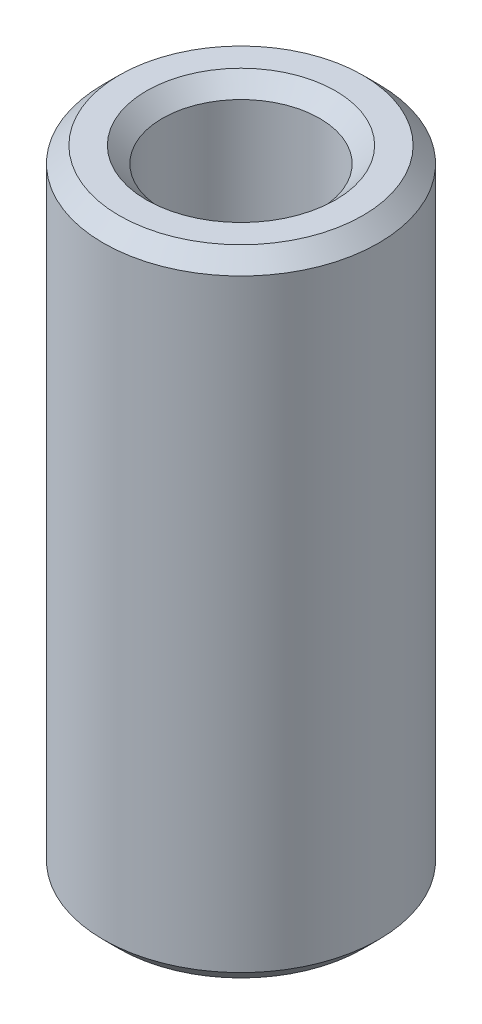
ISO-10303-21;
HEADER;
FILE_DESCRIPTION(('STEP AP214'),'2;1');
FILE_NAME('part.step','',(''),(''),'','','');
FILE_SCHEMA(('AUTOMOTIVE_DESIGN { 1 0 10303 214 1 1 1 1 }'));
ENDSEC;
DATA;
#1=APPLICATION_CONTEXT('core data for automotive mechanical design processes');
#2=APPLICATION_PROTOCOL_DEFINITION('international standard','automotive_design',2000,#1);
#3=PRODUCT_CONTEXT('',#1,'mechanical');
#4=PRODUCT('Part','Part','',(#3));
#5=PRODUCT_RELATED_PRODUCT_CATEGORY('part','',(#4));
#6=PRODUCT_DEFINITION_FORMATION('','',#4);
#7=PRODUCT_DEFINITION_CONTEXT('part definition',#1,'design');
#8=PRODUCT_DEFINITION('design','',#6,#7);
#9=PRODUCT_DEFINITION_SHAPE('','',#8);
#10=(LENGTH_UNIT() NAMED_UNIT(*) SI_UNIT(.MILLI.,.METRE.));
#11=(NAMED_UNIT(*) PLANE_ANGLE_UNIT() SI_UNIT($,.RADIAN.));
#12=(NAMED_UNIT(*) SI_UNIT($,.STERADIAN.) SOLID_ANGLE_UNIT());
#13=UNCERTAINTY_MEASURE_WITH_UNIT(LENGTH_MEASURE(1.E-05),#10,'distance_accuracy_value','');
#14=(GEOMETRIC_REPRESENTATION_CONTEXT(3) GLOBAL_UNCERTAINTY_ASSIGNED_CONTEXT((#13)) GLOBAL_UNIT_ASSIGNED_CONTEXT((#10,
#11,#12)) REPRESENTATION_CONTEXT('',''));
#15=CARTESIAN_POINT('',(0.,0.,0.));
#16=DIRECTION('',(0.,0.,1.));
#17=DIRECTION('',(1.,0.,0.));
#18=AXIS2_PLACEMENT_3D('',#15,#16,#17);
#19=CARTESIAN_POINT('',(0.,15.,0.));
#20=DIRECTION('',(0.,1.,0.));
#21=DIRECTION('',(0.,0.,1.));
#22=AXIS2_PLACEMENT_3D('',#19,#20,#21);
#23=PLANE('',#22);
#24=CARTESIAN_POINT('',(0.,15.,0.));
#25=DIRECTION('',(0.,1.,0.));
#26=DIRECTION('',(0.,0.,1.));
#27=AXIS2_PLACEMENT_3D('',#24,#25,#26);
#28=CIRCLE('',#27,4.46500000000001);
#29=CARTESIAN_POINT('',(0.,15.,4.46500000000001));
#30=VERTEX_POINT('',#29);
#31=EDGE_CURVE('E64',#30,#30,#28,.F.);
#32=ORIENTED_EDGE('',*,*,#31,.T.);
#33=EDGE_LOOP('',(#32));
#34=FACE_BOUND('',#33,.T.);
#35=CARTESIAN_POINT('',(0.,15.,0.));
#36=DIRECTION('',(0.,1.,0.));
#37=DIRECTION('',(0.,0.,1.));
#38=AXIS2_PLACEMENT_3D('',#35,#36,#37);
#39=CIRCLE('',#38,5.74999999999999);
#40=CARTESIAN_POINT('',(0.,15.,5.74999999999999));
#41=VERTEX_POINT('',#40);
#42=EDGE_CURVE('E68',#41,#41,#39,.T.);
#43=ORIENTED_EDGE('',*,*,#42,.T.);
#44=EDGE_LOOP('',(#43));
#45=FACE_BOUND('',#44,.T.);
#46=ADVANCED_FACE('F39',(#34,#45),#23,.T.);
#47=CARTESIAN_POINT('',(0.,-15.,0.));
#48=DIRECTION('',(0.,1.,0.));
#49=DIRECTION('',(0.,0.,1.));
#50=AXIS2_PLACEMENT_3D('',#47,#48,#49);
#51=PLANE('',#50);
#52=CARTESIAN_POINT('',(0.,-15.,0.));
#53=DIRECTION('',(0.,1.,0.));
#54=DIRECTION('',(0.,0.,1.));
#55=AXIS2_PLACEMENT_3D('',#52,#53,#54);
#56=CIRCLE('',#55,4.465);
#57=CARTESIAN_POINT('',(0.,-15.,4.465));
#58=VERTEX_POINT('',#57);
#59=EDGE_CURVE('E53',#58,#58,#56,.T.);
#60=ORIENTED_EDGE('',*,*,#59,.T.);
#61=EDGE_LOOP('',(#60));
#62=FACE_BOUND('',#61,.T.);
#63=CARTESIAN_POINT('',(0.,-15.,0.));
#64=DIRECTION('',(0.,1.,0.));
#65=DIRECTION('',(0.,0.,1.));
#66=AXIS2_PLACEMENT_3D('',#63,#64,#65);
#67=CIRCLE('',#66,5.75);
#68=CARTESIAN_POINT('',(0.,-15.,5.75));
#69=VERTEX_POINT('',#68);
#70=EDGE_CURVE('E58',#69,#69,#67,.F.);
#71=ORIENTED_EDGE('',*,*,#70,.T.);
#72=EDGE_LOOP('',(#71));
#73=FACE_BOUND('',#72,.T.);
#74=ADVANCED_FACE('F91',(#62,#73),#51,.F.);
#75=CARTESIAN_POINT('',(0.,15.,0.));
#76=DIRECTION('',(0.,-1.,0.));
#77=DIRECTION('',(0.,0.,-1.));
#78=AXIS2_PLACEMENT_3D('',#75,#76,#77);
#79=CYLINDRICAL_SURFACE('',#78,6.5);
#80=CARTESIAN_POINT('',(0.,-14.25,0.));
#81=DIRECTION('',(0.,1.,0.));
#82=DIRECTION('',(0.,0.,1.));
#83=AXIS2_PLACEMENT_3D('',#80,#81,#82);
#84=CIRCLE('',#83,6.5);
#85=CARTESIAN_POINT('',(0.,-14.25,6.5));
#86=VERTEX_POINT('',#85);
#87=EDGE_CURVE('E10',#86,#86,#84,.T.);
#88=ORIENTED_EDGE('',*,*,#87,.T.);
#89=EDGE_LOOP('',(#88));
#90=FACE_BOUND('',#89,.T.);
#91=CARTESIAN_POINT('',(0.,14.25,0.));
#92=DIRECTION('',(0.,1.,0.));
#93=DIRECTION('',(0.,0.,1.));
#94=AXIS2_PLACEMENT_3D('',#91,#92,#93);
#95=CIRCLE('',#94,6.5);
#96=CARTESIAN_POINT('',(0.,14.25,6.5));
#97=VERTEX_POINT('',#96);
#98=EDGE_CURVE('E48',#97,#97,#95,.F.);
#99=ORIENTED_EDGE('',*,*,#98,.T.);
#100=EDGE_LOOP('',(#99));
#101=FACE_BOUND('',#100,.T.);
#102=ADVANCED_FACE('F94',(#90,#101),#79,.T.);
#103=CARTESIAN_POINT('',(0.,15.,0.));
#104=DIRECTION('',(0.,-1.,0.));
#105=DIRECTION('',(0.,0.,-1.));
#106=AXIS2_PLACEMENT_3D('',#103,#104,#105);
#107=CYLINDRICAL_SURFACE('',#106,3.715);
#108=CARTESIAN_POINT('',(0.,14.25,0.));
#109=DIRECTION('',(0.,1.,0.));
#110=DIRECTION('',(0.,0.,1.));
#111=AXIS2_PLACEMENT_3D('',#108,#109,#110);
#112=CIRCLE('',#111,3.715);
#113=CARTESIAN_POINT('',(0.,14.25,3.715));
#114=VERTEX_POINT('',#113);
#115=EDGE_CURVE('E72',#114,#114,#112,.T.);
#116=ORIENTED_EDGE('',*,*,#115,.T.);
#117=EDGE_LOOP('',(#116));
#118=FACE_BOUND('',#117,.T.);
#119=CARTESIAN_POINT('',(0.,-14.25,0.));
#120=DIRECTION('',(0.,1.,0.));
#121=DIRECTION('',(0.,0.,1.));
#122=AXIS2_PLACEMENT_3D('',#119,#120,#121);
#123=CIRCLE('',#122,3.715);
#124=CARTESIAN_POINT('',(0.,-14.25,3.715));
#125=VERTEX_POINT('',#124);
#126=EDGE_CURVE('E76',#125,#125,#123,.F.);
#127=ORIENTED_EDGE('',*,*,#126,.T.);
#128=EDGE_LOOP('',(#127));
#129=FACE_BOUND('',#128,.T.);
#130=ADVANCED_FACE('F81',(#118,#129),#107,.F.);
#131=CARTESIAN_POINT('',(0.,14.25,0.));
#132=DIRECTION('',(0.,1.,0.));
#133=DIRECTION('',(0.,0.,1.));
#134=AXIS2_PLACEMENT_3D('',#131,#132,#133);
#135=CONICAL_SURFACE('',#134,3.715,0.78539816339745);
#136=ORIENTED_EDGE('',*,*,#31,.F.);
#137=EDGE_LOOP('',(#136));
#138=FACE_BOUND('',#137,.T.);
#139=ORIENTED_EDGE('',*,*,#115,.F.);
#140=EDGE_LOOP('',(#139));
#141=FACE_BOUND('',#140,.T.);
#142=ADVANCED_FACE('F87',(#138,#141),#135,.F.);
#143=CARTESIAN_POINT('',(0.,-15.,0.));
#144=DIRECTION('',(0.,-1.,0.));
#145=DIRECTION('',(0.,0.,-1.));
#146=AXIS2_PLACEMENT_3D('',#143,#144,#145);
#147=CONICAL_SURFACE('',#146,4.465,0.785398163397448);
#148=ORIENTED_EDGE('',*,*,#126,.F.);
#149=EDGE_LOOP('',(#148));
#150=FACE_BOUND('',#149,.T.);
#151=ORIENTED_EDGE('',*,*,#59,.F.);
#152=EDGE_LOOP('',(#151));
#153=FACE_BOUND('',#152,.T.);
#154=ADVANCED_FACE('F83',(#150,#153),#147,.F.);
#155=CARTESIAN_POINT('',(0.,-14.25,0.));
#156=DIRECTION('',(0.,1.,0.));
#157=DIRECTION('',(0.,0.,1.));
#158=AXIS2_PLACEMENT_3D('',#155,#156,#157);
#159=CONICAL_SURFACE('',#158,6.5,0.785398163397449);
#160=ORIENTED_EDGE('',*,*,#70,.F.);
#161=EDGE_LOOP('',(#160));
#162=FACE_BOUND('',#161,.T.);
#163=ORIENTED_EDGE('',*,*,#87,.F.);
#164=EDGE_LOOP('',(#163));
#165=FACE_BOUND('',#164,.T.);
#166=ADVANCED_FACE('F86',(#162,#165),#159,.T.);
#167=CARTESIAN_POINT('',(0.,15.,0.));
#168=DIRECTION('',(0.,-1.,0.));
#169=DIRECTION('',(0.,0.,-1.));
#170=AXIS2_PLACEMENT_3D('',#167,#168,#169);
#171=CONICAL_SURFACE('',#170,5.74999999999999,0.78539816339745);
#172=ORIENTED_EDGE('',*,*,#98,.F.);
#173=EDGE_LOOP('',(#172));
#174=FACE_BOUND('',#173,.T.);
#175=ORIENTED_EDGE('',*,*,#42,.F.);
#176=EDGE_LOOP('',(#175));
#177=FACE_BOUND('',#176,.T.);
#178=ADVANCED_FACE('F42',(#174,#177),#171,.T.);
#179=CLOSED_SHELL('',(#46,#74,#102,#130,#142,#154,#166,#178));
#180=MANIFOLD_SOLID_BREP('B2',#179);
#181=ADVANCED_BREP_SHAPE_REPRESENTATION('',(#18,#180),#14);
#182=SHAPE_DEFINITION_REPRESENTATION(#9,#181);
ENDSEC;
END-ISO-10303-21;
